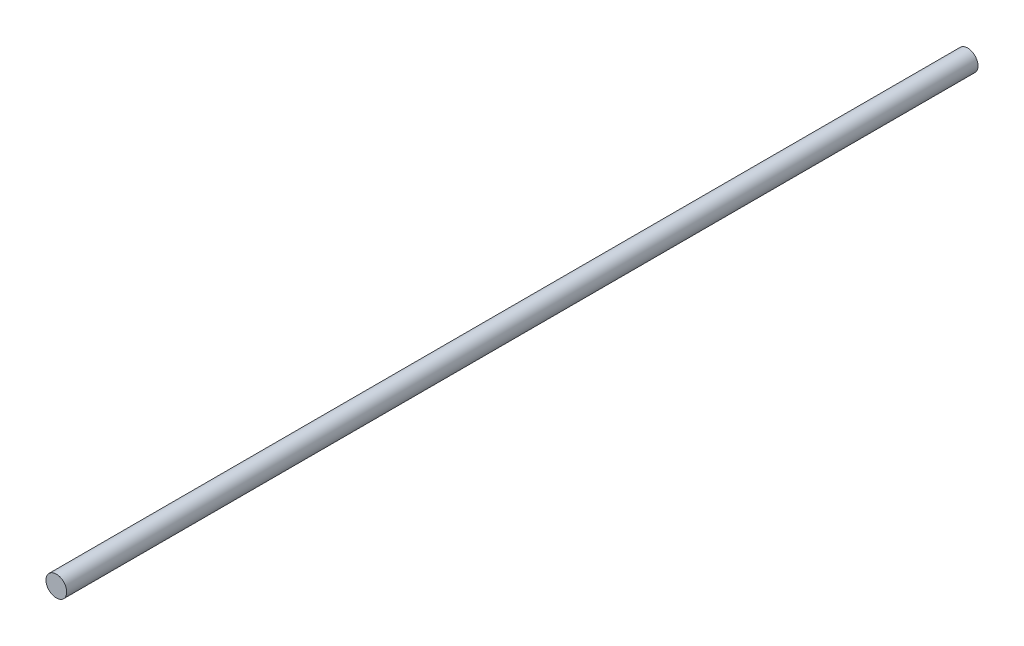
ISO-10303-21;
HEADER;
FILE_DESCRIPTION(('STEP AP214'),'2;1');
FILE_NAME('part.step','',(''),(''),'','','');
FILE_SCHEMA(('AUTOMOTIVE_DESIGN { 1 0 10303 214 1 1 1 1 }'));
ENDSEC;
DATA;
#1=APPLICATION_CONTEXT('core data for automotive mechanical design processes');
#2=APPLICATION_PROTOCOL_DEFINITION('international standard','automotive_design',2000,#1);
#3=PRODUCT_CONTEXT('',#1,'mechanical');
#4=PRODUCT('Part','Part','',(#3));
#5=PRODUCT_RELATED_PRODUCT_CATEGORY('part','',(#4));
#6=PRODUCT_DEFINITION_FORMATION('','',#4);
#7=PRODUCT_DEFINITION_CONTEXT('part definition',#1,'design');
#8=PRODUCT_DEFINITION('design','',#6,#7);
#9=PRODUCT_DEFINITION_SHAPE('','',#8);
#10=(LENGTH_UNIT() NAMED_UNIT(*) SI_UNIT(.MILLI.,.METRE.));
#11=(NAMED_UNIT(*) PLANE_ANGLE_UNIT() SI_UNIT($,.RADIAN.));
#12=(NAMED_UNIT(*) SI_UNIT($,.STERADIAN.) SOLID_ANGLE_UNIT());
#13=UNCERTAINTY_MEASURE_WITH_UNIT(LENGTH_MEASURE(1.E-05),#10,'distance_accuracy_value','');
#14=(GEOMETRIC_REPRESENTATION_CONTEXT(3) GLOBAL_UNCERTAINTY_ASSIGNED_CONTEXT((#13)) GLOBAL_UNIT_ASSIGNED_CONTEXT((#10,
#11,#12)) REPRESENTATION_CONTEXT('',''));
#15=CARTESIAN_POINT('',(0.,0.,0.));
#16=DIRECTION('',(0.,0.,1.));
#17=DIRECTION('',(1.,0.,0.));
#18=AXIS2_PLACEMENT_3D('',#15,#16,#17);
#19=CARTESIAN_POINT('',(0.,0.,264.));
#20=DIRECTION('',(0.,0.,-1.));
#21=DIRECTION('',(-1.,0.,0.));
#22=AXIS2_PLACEMENT_3D('',#19,#20,#21);
#23=CYLINDRICAL_SURFACE('',#22,3.);
#24=CARTESIAN_POINT('',(0.,0.,264.));
#25=DIRECTION('',(0.,0.,1.));
#26=DIRECTION('',(1.,0.,0.));
#27=AXIS2_PLACEMENT_3D('',#24,#25,#26);
#28=CIRCLE('',#27,3.);
#29=CARTESIAN_POINT('',(3.,0.,264.));
#30=VERTEX_POINT('',#29);
#31=EDGE_CURVE('E10',#30,#30,#28,.T.);
#32=ORIENTED_EDGE('',*,*,#31,.F.);
#33=EDGE_LOOP('',(#32));
#34=FACE_BOUND('',#33,.T.);
#35=CARTESIAN_POINT('',(0.,0.,0.));
#36=DIRECTION('',(0.,0.,1.));
#37=DIRECTION('',(1.,0.,0.));
#38=AXIS2_PLACEMENT_3D('',#35,#36,#37);
#39=CIRCLE('',#38,3.);
#40=CARTESIAN_POINT('',(3.,0.,0.));
#41=VERTEX_POINT('',#40);
#42=EDGE_CURVE('E31',#41,#41,#39,.T.);
#43=ORIENTED_EDGE('',*,*,#42,.T.);
#44=EDGE_LOOP('',(#43));
#45=FACE_BOUND('',#44,.T.);
#46=ADVANCED_FACE('F28',(#34,#45),#23,.T.);
#47=CARTESIAN_POINT('',(0.,0.,264.));
#48=DIRECTION('',(0.,0.,1.));
#49=DIRECTION('',(1.,0.,0.));
#50=AXIS2_PLACEMENT_3D('',#47,#48,#49);
#51=PLANE('',#50);
#52=ORIENTED_EDGE('',*,*,#31,.T.);
#53=EDGE_LOOP('',(#52));
#54=FACE_BOUND('',#53,.T.);
#55=ADVANCED_FACE('F43',(#54),#51,.T.);
#56=CARTESIAN_POINT('',(0.,0.,0.));
#57=DIRECTION('',(0.,0.,1.));
#58=DIRECTION('',(1.,0.,0.));
#59=AXIS2_PLACEMENT_3D('',#56,#57,#58);
#60=PLANE('',#59);
#61=ORIENTED_EDGE('',*,*,#42,.F.);
#62=EDGE_LOOP('',(#61));
#63=FACE_BOUND('',#62,.T.);
#64=ADVANCED_FACE('F41',(#63),#60,.F.);
#65=CLOSED_SHELL('',(#46,#55,#64));
#66=MANIFOLD_SOLID_BREP('B2',#65);
#67=ADVANCED_BREP_SHAPE_REPRESENTATION('',(#18,#66),#14);
#68=SHAPE_DEFINITION_REPRESENTATION(#9,#67);
ENDSEC;
END-ISO-10303-21;
